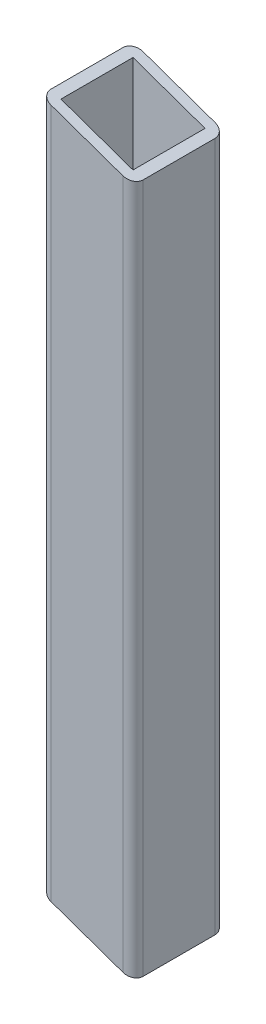
ISO-10303-21;
HEADER;
FILE_DESCRIPTION(('STEP AP214'),'2;1');
FILE_NAME('part.step','',(''),(''),'','','');
FILE_SCHEMA(('AUTOMOTIVE_DESIGN { 1 0 10303 214 1 1 1 1 }'));
ENDSEC;
DATA;
#1=APPLICATION_CONTEXT('core data for automotive mechanical design processes');
#2=APPLICATION_PROTOCOL_DEFINITION('international standard','automotive_design',2000,#1);
#3=PRODUCT_CONTEXT('',#1,'mechanical');
#4=PRODUCT('Part','Part','',(#3));
#5=PRODUCT_RELATED_PRODUCT_CATEGORY('part','',(#4));
#6=PRODUCT_DEFINITION_FORMATION('','',#4);
#7=PRODUCT_DEFINITION_CONTEXT('part definition',#1,'design');
#8=PRODUCT_DEFINITION('design','',#6,#7);
#9=PRODUCT_DEFINITION_SHAPE('','',#8);
#10=(LENGTH_UNIT() NAMED_UNIT(*) SI_UNIT(.MILLI.,.METRE.));
#11=(NAMED_UNIT(*) PLANE_ANGLE_UNIT() SI_UNIT($,.RADIAN.));
#12=(NAMED_UNIT(*) SI_UNIT($,.STERADIAN.) SOLID_ANGLE_UNIT());
#13=UNCERTAINTY_MEASURE_WITH_UNIT(LENGTH_MEASURE(1.E-05),#10,'distance_accuracy_value','');
#14=(GEOMETRIC_REPRESENTATION_CONTEXT(3) GLOBAL_UNCERTAINTY_ASSIGNED_CONTEXT((#13)) GLOBAL_UNIT_ASSIGNED_CONTEXT((#10,
#11,#12)) REPRESENTATION_CONTEXT('',''));
#15=CARTESIAN_POINT('',(0.,0.,0.));
#16=DIRECTION('',(0.,0.,1.));
#17=DIRECTION('',(1.,0.,0.));
#18=AXIS2_PLACEMENT_3D('',#15,#16,#17);
#19=CARTESIAN_POINT('',(22.8,200.5,2.8));
#20=DIRECTION('',(0.,-1.,0.));
#21=DIRECTION('',(0.,0.,-1.));
#22=AXIS2_PLACEMENT_3D('',#19,#20,#21);
#23=CYLINDRICAL_SURFACE('',#22,2.8);
#24=CARTESIAN_POINT('',(22.8,192.473516729513,2.8));
#25=DIRECTION('',(0.332063070829075,0.943257184966839,0.));
#26=DIRECTION('',(0.943257184966839,-0.332063070829075,0.));
#27=AXIS2_PLACEMENT_3D('',#24,#25,#26);
#28=ELLIPSE('',#27,2.9684375,2.8);
#29=CARTESIAN_POINT('',(25.6,191.487808257699,2.80000000000002));
#30=VERTEX_POINT('',#29);
#31=CARTESIAN_POINT('',(22.8,192.473516729513,0.));
#32=VERTEX_POINT('',#31);
#33=EDGE_CURVE('E209',#30,#32,#28,.T.);
#34=ORIENTED_EDGE('',*,*,#33,.F.);
#35=DIRECTION('',(0.,-1.,0.));
#36=VECTOR('',#35,1.);
#37=CARTESIAN_POINT('',(25.6,200.5,2.80000000000002));
#38=LINE('',#37,#36);
#39=CARTESIAN_POINT('',(25.6,0.,2.80000000000002));
#40=VERTEX_POINT('',#39);
#41=EDGE_CURVE('E145',#30,#40,#38,.T.);
#42=ORIENTED_EDGE('',*,*,#41,.T.);
#43=CARTESIAN_POINT('',(22.8,0.984390166549831,2.8));
#44=DIRECTION('',(-0.331667845872584,-0.943396226415094,0.));
#45=DIRECTION('',(0.943396226415094,-0.331667845872584,0.));
#46=AXIS2_PLACEMENT_3D('',#43,#44,#45);
#47=ELLIPSE('',#46,2.968,2.8);
#48=CARTESIAN_POINT('',(22.8,0.984390166549842,0.));
#49=VERTEX_POINT('',#48);
#50=EDGE_CURVE('E175',#49,#40,#47,.T.);
#51=ORIENTED_EDGE('',*,*,#50,.F.);
#52=DIRECTION('',(0.,-1.,0.));
#53=VECTOR('',#52,1.);
#54=CARTESIAN_POINT('',(22.8,200.5,0.));
#55=LINE('',#54,#53);
#56=EDGE_CURVE('E41',#32,#49,#55,.T.);
#57=ORIENTED_EDGE('',*,*,#56,.F.);
#58=EDGE_LOOP('',(#34,#42,#51,#57));
#59=FACE_BOUND('',#58,.T.);
#60=ADVANCED_FACE('F34',(#59),#23,.T.);
#61=CARTESIAN_POINT('',(2.80000000000002,200.5,0.));
#62=DIRECTION('',(0.,0.,1.));
#63=DIRECTION('',(1.,0.,0.));
#64=AXIS2_PLACEMENT_3D('',#61,#62,#63);
#65=PLANE('',#64);
#66=DIRECTION('',(-0.943257184966839,0.332063070829075,0.));
#67=VECTOR('',#66,1.);
#68=CARTESIAN_POINT('',(2.4912555275764,199.622981543219,0.));
#69=LINE('',#68,#67);
#70=CARTESIAN_POINT('',(2.80000000000002,199.514291528186,0.));
#71=VERTEX_POINT('',#70);
#72=EDGE_CURVE('E48',#32,#71,#69,.T.);
#73=ORIENTED_EDGE('',*,*,#72,.F.);
#74=ORIENTED_EDGE('',*,*,#56,.T.);
#75=DIRECTION('',(0.943396226415094,-0.331667845872584,0.));
#76=VECTOR('',#75,1.);
#77=CARTESIAN_POINT('',(-57.4272047733181,29.1897014053476,0.));
#78=LINE('',#77,#76);
#79=CARTESIAN_POINT('',(2.80000000000002,8.01574849904865,0.));
#80=VERTEX_POINT('',#79);
#81=EDGE_CURVE('E166',#80,#49,#78,.T.);
#82=ORIENTED_EDGE('',*,*,#81,.F.);
#83=DIRECTION('',(0.,-1.,0.));
#84=VECTOR('',#83,1.);
#85=CARTESIAN_POINT('',(2.80000000000002,200.5,0.));
#86=LINE('',#85,#84);
#87=EDGE_CURVE('E162',#71,#80,#86,.T.);
#88=ORIENTED_EDGE('',*,*,#87,.F.);
#89=EDGE_LOOP('',(#73,#74,#82,#88));
#90=FACE_BOUND('',#89,.T.);
#91=ADVANCED_FACE('F165',(#90),#65,.F.);
#92=CARTESIAN_POINT('',(2.8,200.5,2.8));
#93=DIRECTION('',(0.,-1.,0.));
#94=DIRECTION('',(0.,0.,-1.));
#95=AXIS2_PLACEMENT_3D('',#92,#93,#94);
#96=CYLINDRICAL_SURFACE('',#95,2.8);
#97=CARTESIAN_POINT('',(2.8,199.514291528186,2.8));
#98=DIRECTION('',(0.332063070829075,0.943257184966839,0.));
#99=DIRECTION('',(0.943257184966839,-0.332063070829075,0.));
#100=AXIS2_PLACEMENT_3D('',#97,#98,#99);
#101=ELLIPSE('',#100,2.9684375,2.8);
#102=CARTESIAN_POINT('',(0.,200.5,2.80000000000002));
#103=VERTEX_POINT('',#102);
#104=EDGE_CURVE('E56',#71,#103,#101,.T.);
#105=ORIENTED_EDGE('',*,*,#104,.F.);
#106=ORIENTED_EDGE('',*,*,#87,.T.);
#107=CARTESIAN_POINT('',(2.8,8.01574849904862,2.8));
#108=DIRECTION('',(-0.331667845872584,-0.943396226415094,0.));
#109=DIRECTION('',(0.943396226415094,-0.331667845872584,0.));
#110=AXIS2_PLACEMENT_3D('',#107,#108,#109);
#111=ELLIPSE('',#110,2.968,2.8);
#112=CARTESIAN_POINT('',(0.,9.00013866559843,2.80000000000002));
#113=VERTEX_POINT('',#112);
#114=EDGE_CURVE('E177',#113,#80,#111,.T.);
#115=ORIENTED_EDGE('',*,*,#114,.F.);
#116=DIRECTION('',(0.,-1.,0.));
#117=VECTOR('',#116,1.);
#118=CARTESIAN_POINT('',(0.,200.5,2.80000000000002));
#119=LINE('',#118,#117);
#120=EDGE_CURVE('E132',#103,#113,#119,.T.);
#121=ORIENTED_EDGE('',*,*,#120,.F.);
#122=EDGE_LOOP('',(#105,#106,#115,#121));
#123=FACE_BOUND('',#122,.T.);
#124=ADVANCED_FACE('F256',(#123),#96,.T.);
#125=CARTESIAN_POINT('',(2.8,200.5,22.8));
#126=DIRECTION('',(0.,-1.,0.));
#127=DIRECTION('',(0.,0.,-1.));
#128=AXIS2_PLACEMENT_3D('',#125,#126,#127);
#129=CYLINDRICAL_SURFACE('',#128,2.8);
#130=CARTESIAN_POINT('',(2.8,199.514291528186,22.8));
#131=DIRECTION('',(0.332063070829075,0.943257184966839,0.));
#132=DIRECTION('',(0.943257184966839,-0.332063070829075,0.));
#133=AXIS2_PLACEMENT_3D('',#130,#131,#132);
#134=ELLIPSE('',#133,2.9684375,2.8);
#135=CARTESIAN_POINT('',(0.,200.5,22.8));
#136=VERTEX_POINT('',#135);
#137=CARTESIAN_POINT('',(2.80000000000002,199.514291528186,25.6));
#138=VERTEX_POINT('',#137);
#139=EDGE_CURVE('E137',#136,#138,#134,.T.);
#140=ORIENTED_EDGE('',*,*,#139,.F.);
#141=DIRECTION('',(0.,-1.,0.));
#142=VECTOR('',#141,1.);
#143=CARTESIAN_POINT('',(0.,200.5,22.8));
#144=LINE('',#143,#142);
#145=CARTESIAN_POINT('',(0.,9.00013866559845,22.8));
#146=VERTEX_POINT('',#145);
#147=EDGE_CURVE('E123',#136,#146,#144,.T.);
#148=ORIENTED_EDGE('',*,*,#147,.T.);
#149=CARTESIAN_POINT('',(2.8,8.01574849904862,22.8));
#150=DIRECTION('',(-0.331667845872584,-0.943396226415094,0.));
#151=DIRECTION('',(0.943396226415094,-0.331667845872584,0.));
#152=AXIS2_PLACEMENT_3D('',#149,#150,#151);
#153=ELLIPSE('',#152,2.968,2.8);
#154=CARTESIAN_POINT('',(2.80000000000002,8.0157484990486,25.6));
#155=VERTEX_POINT('',#154);
#156=EDGE_CURVE('E220',#155,#146,#153,.T.);
#157=ORIENTED_EDGE('',*,*,#156,.F.);
#158=DIRECTION('',(0.,-1.,0.));
#159=VECTOR('',#158,1.);
#160=CARTESIAN_POINT('',(2.80000000000002,200.5,25.6));
#161=LINE('',#160,#159);
#162=EDGE_CURVE('E133',#138,#155,#161,.T.);
#163=ORIENTED_EDGE('',*,*,#162,.F.);
#164=EDGE_LOOP('',(#140,#148,#157,#163));
#165=FACE_BOUND('',#164,.T.);
#166=ADVANCED_FACE('F138',(#165),#129,.T.);
#167=CARTESIAN_POINT('',(2.80000000000002,200.5,25.6));
#168=DIRECTION('',(0.,0.,-1.));
#169=DIRECTION('',(-1.,0.,0.));
#170=AXIS2_PLACEMENT_3D('',#167,#168,#169);
#171=PLANE('',#170);
#172=DIRECTION('',(0.943257184966839,-0.332063070829075,0.));
#173=VECTOR('',#172,1.);
#174=CARTESIAN_POINT('',(2.4912555275764,199.622981543219,25.6));
#175=LINE('',#174,#173);
#176=CARTESIAN_POINT('',(22.8,192.473516729513,25.6));
#177=VERTEX_POINT('',#176);
#178=EDGE_CURVE('E141',#138,#177,#175,.T.);
#179=ORIENTED_EDGE('',*,*,#178,.F.);
#180=ORIENTED_EDGE('',*,*,#162,.T.);
#181=DIRECTION('',(-0.943396226415094,0.331667845872584,0.));
#182=VECTOR('',#181,1.);
#183=CARTESIAN_POINT('',(-57.4272047733181,29.1897014053476,25.6));
#184=LINE('',#183,#182);
#185=CARTESIAN_POINT('',(22.8,0.984390166549831,25.6));
#186=VERTEX_POINT('',#185);
#187=EDGE_CURVE('E217',#186,#155,#184,.T.);
#188=ORIENTED_EDGE('',*,*,#187,.F.);
#189=DIRECTION('',(0.,-1.,0.));
#190=VECTOR('',#189,1.);
#191=CARTESIAN_POINT('',(22.8,200.5,25.6));
#192=LINE('',#191,#190);
#193=EDGE_CURVE('E158',#177,#186,#192,.T.);
#194=ORIENTED_EDGE('',*,*,#193,.F.);
#195=EDGE_LOOP('',(#179,#180,#188,#194));
#196=FACE_BOUND('',#195,.T.);
#197=ADVANCED_FACE('F225',(#196),#171,.F.);
#198=CARTESIAN_POINT('',(22.8,200.5,22.8));
#199=DIRECTION('',(0.,-1.,0.));
#200=DIRECTION('',(0.,0.,-1.));
#201=AXIS2_PLACEMENT_3D('',#198,#199,#200);
#202=CYLINDRICAL_SURFACE('',#201,2.8);
#203=CARTESIAN_POINT('',(22.8,192.473516729513,22.8));
#204=DIRECTION('',(0.332063070829075,0.943257184966839,0.));
#205=DIRECTION('',(0.943257184966839,-0.332063070829075,0.));
#206=AXIS2_PLACEMENT_3D('',#203,#204,#205);
#207=ELLIPSE('',#206,2.9684375,2.8);
#208=CARTESIAN_POINT('',(25.6,191.487808257699,22.8));
#209=VERTEX_POINT('',#208);
#210=EDGE_CURVE('E227',#177,#209,#207,.T.);
#211=ORIENTED_EDGE('',*,*,#210,.F.);
#212=ORIENTED_EDGE('',*,*,#193,.T.);
#213=CARTESIAN_POINT('',(22.8,0.984390166549831,22.8));
#214=DIRECTION('',(-0.331667845872584,-0.943396226415094,0.));
#215=DIRECTION('',(0.943396226415094,-0.331667845872584,0.));
#216=AXIS2_PLACEMENT_3D('',#213,#214,#215);
#217=ELLIPSE('',#216,2.968,2.8);
#218=CARTESIAN_POINT('',(25.6,0.,22.8));
#219=VERTEX_POINT('',#218);
#220=EDGE_CURVE('E214',#219,#186,#217,.T.);
#221=ORIENTED_EDGE('',*,*,#220,.F.);
#222=DIRECTION('',(0.,-1.,0.));
#223=VECTOR('',#222,1.);
#224=CARTESIAN_POINT('',(25.6,200.5,22.8));
#225=LINE('',#224,#223);
#226=EDGE_CURVE('E148',#209,#219,#225,.T.);
#227=ORIENTED_EDGE('',*,*,#226,.F.);
#228=EDGE_LOOP('',(#211,#212,#221,#227));
#229=FACE_BOUND('',#228,.T.);
#230=ADVANCED_FACE('F239',(#229),#202,.T.);
#231=CARTESIAN_POINT('',(22.8,200.5,2.8));
#232=DIRECTION('',(1.,0.,0.));
#233=DIRECTION('',(0.,0.,-1.));
#234=AXIS2_PLACEMENT_3D('',#231,#232,#233);
#235=PLANE('',#234);
#236=DIRECTION('',(0.,0.,1.));
#237=VECTOR('',#236,1.);
#238=CARTESIAN_POINT('',(22.8,192.473516729513,2.8));
#239=LINE('',#238,#237);
#240=CARTESIAN_POINT('',(22.8,192.473516729513,2.8));
#241=VERTEX_POINT('',#240);
#242=CARTESIAN_POINT('',(22.8,192.473516729513,22.8));
#243=VERTEX_POINT('',#242);
#244=EDGE_CURVE('E229',#241,#243,#239,.T.);
#245=ORIENTED_EDGE('',*,*,#244,.F.);
#246=DIRECTION('',(0.,-1.,0.));
#247=VECTOR('',#246,1.);
#248=CARTESIAN_POINT('',(22.8,200.5,2.8));
#249=LINE('',#248,#247);
#250=CARTESIAN_POINT('',(22.8,0.984390166549842,2.8));
#251=VERTEX_POINT('',#250);
#252=EDGE_CURVE('E151',#241,#251,#249,.T.);
#253=ORIENTED_EDGE('',*,*,#252,.T.);
#254=DIRECTION('',(0.,0.,-1.));
#255=VECTOR('',#254,1.);
#256=CARTESIAN_POINT('',(22.8,0.984390166549831,2.80000000000002));
#257=LINE('',#256,#255);
#258=CARTESIAN_POINT('',(22.8,0.984390166549824,22.8));
#259=VERTEX_POINT('',#258);
#260=EDGE_CURVE('E207',#259,#251,#257,.T.);
#261=ORIENTED_EDGE('',*,*,#260,.F.);
#262=DIRECTION('',(0.,-1.,0.));
#263=VECTOR('',#262,1.);
#264=CARTESIAN_POINT('',(22.8,200.5,22.8));
#265=LINE('',#264,#263);
#266=EDGE_CURVE('E154',#243,#259,#265,.T.);
#267=ORIENTED_EDGE('',*,*,#266,.F.);
#268=EDGE_LOOP('',(#245,#253,#261,#267));
#269=FACE_BOUND('',#268,.T.);
#270=ADVANCED_FACE('F241',(#269),#235,.F.);
#271=CARTESIAN_POINT('',(2.8,200.5,2.8));
#272=DIRECTION('',(0.,0.,-1.));
#273=DIRECTION('',(-1.,0.,0.));
#274=AXIS2_PLACEMENT_3D('',#271,#272,#273);
#275=PLANE('',#274);
#276=DIRECTION('',(0.943257184966839,-0.332063070829075,0.));
#277=VECTOR('',#276,1.);
#278=CARTESIAN_POINT('',(2.49125552757638,199.622981543219,2.8));
#279=LINE('',#278,#277);
#280=CARTESIAN_POINT('',(2.8,199.514291528186,2.8));
#281=VERTEX_POINT('',#280);
#282=EDGE_CURVE('E358',#281,#241,#279,.T.);
#283=ORIENTED_EDGE('',*,*,#282,.F.);
#284=DIRECTION('',(0.,-1.,0.));
#285=VECTOR('',#284,1.);
#286=CARTESIAN_POINT('',(2.8,200.5,2.8));
#287=LINE('',#286,#285);
#288=CARTESIAN_POINT('',(2.8,8.01574849904868,2.8));
#289=VERTEX_POINT('',#288);
#290=EDGE_CURVE('E185',#281,#289,#287,.T.);
#291=ORIENTED_EDGE('',*,*,#290,.T.);
#292=DIRECTION('',(-0.943396226415094,0.331667845872584,0.));
#293=VECTOR('',#292,1.);
#294=CARTESIAN_POINT('',(-57.4272047733181,29.1897014053476,2.79999999999999));
#295=LINE('',#294,#293);
#296=EDGE_CURVE('E205',#251,#289,#295,.T.);
#297=ORIENTED_EDGE('',*,*,#296,.F.);
#298=ORIENTED_EDGE('',*,*,#252,.F.);
#299=EDGE_LOOP('',(#283,#291,#297,#298));
#300=FACE_BOUND('',#299,.T.);
#301=ADVANCED_FACE('F247',(#300),#275,.F.);
#302=CARTESIAN_POINT('',(2.8,200.5,2.8));
#303=DIRECTION('',(-1.,0.,0.));
#304=DIRECTION('',(0.,0.,1.));
#305=AXIS2_PLACEMENT_3D('',#302,#303,#304);
#306=PLANE('',#305);
#307=DIRECTION('',(0.,0.,-1.));
#308=VECTOR('',#307,1.);
#309=CARTESIAN_POINT('',(2.8,199.514291528186,2.8));
#310=LINE('',#309,#308);
#311=CARTESIAN_POINT('',(2.8,199.514291528186,22.8));
#312=VERTEX_POINT('',#311);
#313=EDGE_CURVE('E196',#312,#281,#310,.T.);
#314=ORIENTED_EDGE('',*,*,#313,.F.);
#315=DIRECTION('',(0.,-1.,0.));
#316=VECTOR('',#315,1.);
#317=CARTESIAN_POINT('',(2.8,200.5,22.8));
#318=LINE('',#317,#316);
#319=CARTESIAN_POINT('',(2.8,8.01574849904863,22.8));
#320=VERTEX_POINT('',#319);
#321=EDGE_CURVE('E181',#312,#320,#318,.T.);
#322=ORIENTED_EDGE('',*,*,#321,.T.);
#323=DIRECTION('',(0.,0.,1.));
#324=VECTOR('',#323,1.);
#325=CARTESIAN_POINT('',(2.8,8.01574849904862,2.80000000000002));
#326=LINE('',#325,#324);
#327=EDGE_CURVE('E193',#289,#320,#326,.T.);
#328=ORIENTED_EDGE('',*,*,#327,.F.);
#329=ORIENTED_EDGE('',*,*,#290,.F.);
#330=EDGE_LOOP('',(#314,#322,#328,#329));
#331=FACE_BOUND('',#330,.T.);
#332=ADVANCED_FACE('F190',(#331),#306,.F.);
#333=CARTESIAN_POINT('',(2.8,200.5,22.8));
#334=DIRECTION('',(0.,0.,1.));
#335=DIRECTION('',(1.,0.,0.));
#336=AXIS2_PLACEMENT_3D('',#333,#334,#335);
#337=PLANE('',#336);
#338=DIRECTION('',(-0.943257184966839,0.332063070829075,0.));
#339=VECTOR('',#338,1.);
#340=CARTESIAN_POINT('',(2.49125552757638,199.622981543219,22.8));
#341=LINE('',#340,#339);
#342=EDGE_CURVE('E361',#243,#312,#341,.T.);
#343=ORIENTED_EDGE('',*,*,#342,.F.);
#344=ORIENTED_EDGE('',*,*,#266,.T.);
#345=DIRECTION('',(0.943396226415094,-0.331667845872584,0.));
#346=VECTOR('',#345,1.);
#347=CARTESIAN_POINT('',(-57.4272047733181,29.1897014053476,22.8));
#348=LINE('',#347,#346);
#349=EDGE_CURVE('E11',#320,#259,#348,.T.);
#350=ORIENTED_EDGE('',*,*,#349,.F.);
#351=ORIENTED_EDGE('',*,*,#321,.F.);
#352=EDGE_LOOP('',(#343,#344,#350,#351));
#353=FACE_BOUND('',#352,.T.);
#354=ADVANCED_FACE('F199',(#353),#337,.F.);
#355=CARTESIAN_POINT('',(25.6,200.5,2.80000000000002));
#356=DIRECTION('',(-1.,0.,0.));
#357=DIRECTION('',(0.,0.,1.));
#358=AXIS2_PLACEMENT_3D('',#355,#356,#357);
#359=PLANE('',#358);
#360=DIRECTION('',(0.,0.,-1.));
#361=VECTOR('',#360,1.);
#362=CARTESIAN_POINT('',(25.6,191.487808257699,305.978013627011));
#363=LINE('',#362,#361);
#364=EDGE_CURVE('E234',#209,#30,#363,.T.);
#365=ORIENTED_EDGE('',*,*,#364,.F.);
#366=ORIENTED_EDGE('',*,*,#226,.T.);
#367=DIRECTION('',(0.,0.,-1.));
#368=VECTOR('',#367,1.);
#369=CARTESIAN_POINT('',(25.6,0.,2.80000000000002));
#370=LINE('',#369,#368);
#371=EDGE_CURVE('E146',#219,#40,#370,.T.);
#372=ORIENTED_EDGE('',*,*,#371,.T.);
#373=ORIENTED_EDGE('',*,*,#41,.F.);
#374=EDGE_LOOP('',(#365,#366,#372,#373));
#375=FACE_BOUND('',#374,.T.);
#376=ADVANCED_FACE('F236',(#375),#359,.F.);
#377=CARTESIAN_POINT('',(0.,200.5,2.80000000000002));
#378=DIRECTION('',(1.,0.,0.));
#379=DIRECTION('',(0.,0.,-1.));
#380=AXIS2_PLACEMENT_3D('',#377,#378,#379);
#381=PLANE('',#380);
#382=DIRECTION('',(0.,0.,-1.));
#383=VECTOR('',#382,1.);
#384=CARTESIAN_POINT('',(0.,9.00013866559843,305.978013627011));
#385=LINE('',#384,#383);
#386=EDGE_CURVE('E129',#146,#113,#385,.T.);
#387=ORIENTED_EDGE('',*,*,#386,.F.);
#388=ORIENTED_EDGE('',*,*,#147,.F.);
#389=DIRECTION('',(0.,0.,1.));
#390=VECTOR('',#389,1.);
#391=CARTESIAN_POINT('',(0.,200.5,2.80000000000002));
#392=LINE('',#391,#390);
#393=EDGE_CURVE('E128',#103,#136,#392,.T.);
#394=ORIENTED_EDGE('',*,*,#393,.F.);
#395=ORIENTED_EDGE('',*,*,#120,.T.);
#396=EDGE_LOOP('',(#387,#388,#394,#395));
#397=FACE_BOUND('',#396,.T.);
#398=ADVANCED_FACE('F125',(#397),#381,.F.);
#399=CARTESIAN_POINT('',(25.6,0.,305.978013627011));
#400=DIRECTION('',(-0.331667845872584,-0.943396226415094,0.));
#401=DIRECTION('',(0.943396226415094,-0.331667845872584,0.));
#402=AXIS2_PLACEMENT_3D('',#399,#400,#401);
#403=PLANE('',#402);
#404=ORIENTED_EDGE('',*,*,#349,.T.);
#405=ORIENTED_EDGE('',*,*,#260,.T.);
#406=ORIENTED_EDGE('',*,*,#296,.T.);
#407=ORIENTED_EDGE('',*,*,#327,.T.);
#408=EDGE_LOOP('',(#404,#405,#406,#407));
#409=FACE_BOUND('',#408,.T.);
#410=ORIENTED_EDGE('',*,*,#81,.T.);
#411=ORIENTED_EDGE('',*,*,#50,.T.);
#412=ORIENTED_EDGE('',*,*,#371,.F.);
#413=ORIENTED_EDGE('',*,*,#220,.T.);
#414=ORIENTED_EDGE('',*,*,#187,.T.);
#415=ORIENTED_EDGE('',*,*,#156,.T.);
#416=ORIENTED_EDGE('',*,*,#386,.T.);
#417=ORIENTED_EDGE('',*,*,#114,.T.);
#418=EDGE_LOOP('',(#410,#411,#412,#413,#414,#415,#416,#417));
#419=FACE_BOUND('',#418,.T.);
#420=ADVANCED_FACE('F173',(#409,#419),#403,.T.);
#421=CARTESIAN_POINT('',(0.,200.5,305.978013627011));
#422=DIRECTION('',(0.332063070829075,0.943257184966839,0.));
#423=DIRECTION('',(-0.943257184966839,0.332063070829075,0.));
#424=AXIS2_PLACEMENT_3D('',#421,#422,#423);
#425=PLANE('',#424);
#426=ORIENTED_EDGE('',*,*,#282,.T.);
#427=ORIENTED_EDGE('',*,*,#244,.T.);
#428=ORIENTED_EDGE('',*,*,#342,.T.);
#429=ORIENTED_EDGE('',*,*,#313,.T.);
#430=EDGE_LOOP('',(#426,#427,#428,#429));
#431=FACE_BOUND('',#430,.T.);
#432=ORIENTED_EDGE('',*,*,#364,.T.);
#433=ORIENTED_EDGE('',*,*,#33,.T.);
#434=ORIENTED_EDGE('',*,*,#72,.T.);
#435=ORIENTED_EDGE('',*,*,#104,.T.);
#436=ORIENTED_EDGE('',*,*,#393,.T.);
#437=ORIENTED_EDGE('',*,*,#139,.T.);
#438=ORIENTED_EDGE('',*,*,#178,.T.);
#439=ORIENTED_EDGE('',*,*,#210,.T.);
#440=EDGE_LOOP('',(#432,#433,#434,#435,#436,#437,#438,#439));
#441=FACE_BOUND('',#440,.T.);
#442=ADVANCED_FACE('F144',(#431,#441),#425,.T.);
#443=CLOSED_SHELL('',(#60,#91,#124,#166,#197,#230,#270,#301,#332,#354,#376,#398,#420,#442));
#444=MANIFOLD_SOLID_BREP('B2',#443);
#445=ADVANCED_BREP_SHAPE_REPRESENTATION('',(#18,#444),#14);
#446=SHAPE_DEFINITION_REPRESENTATION(#9,#445);
ENDSEC;
END-ISO-10303-21;
